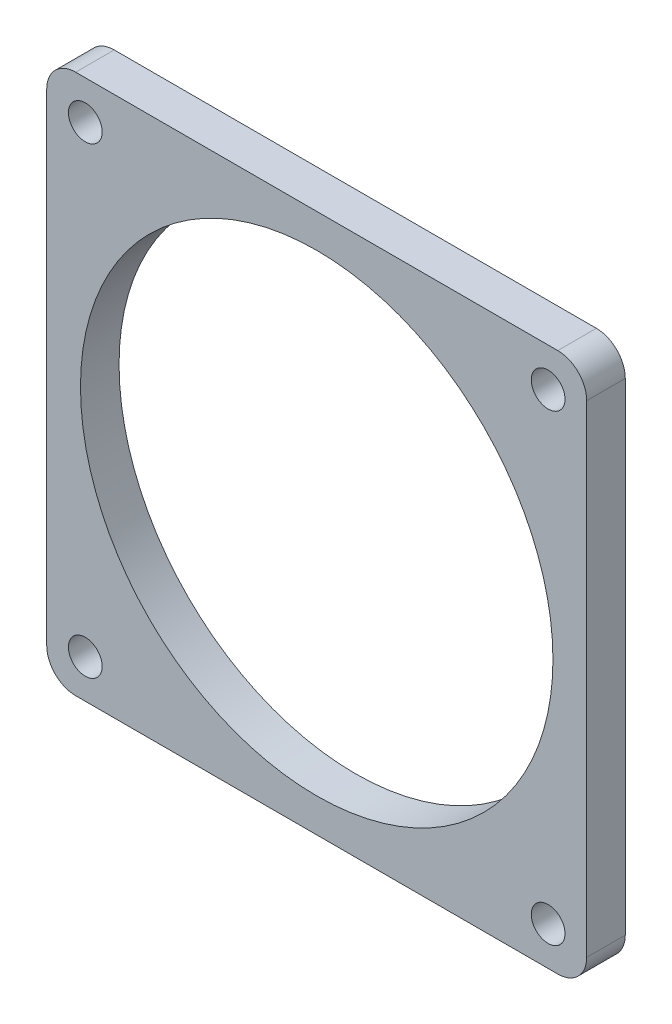
ISO-10303-21;
HEADER;
FILE_DESCRIPTION(('STEP AP214'),'2;1');
FILE_NAME('part.step','',(''),(''),'','','');
FILE_SCHEMA(('AUTOMOTIVE_DESIGN { 1 0 10303 214 1 1 1 1 }'));
ENDSEC;
DATA;
#1=APPLICATION_CONTEXT('core data for automotive mechanical design processes');
#2=APPLICATION_PROTOCOL_DEFINITION('international standard','automotive_design',2000,#1);
#3=PRODUCT_CONTEXT('',#1,'mechanical');
#4=PRODUCT('Part','Part','',(#3));
#5=PRODUCT_RELATED_PRODUCT_CATEGORY('part','',(#4));
#6=PRODUCT_DEFINITION_FORMATION('','',#4);
#7=PRODUCT_DEFINITION_CONTEXT('part definition',#1,'design');
#8=PRODUCT_DEFINITION('design','',#6,#7);
#9=PRODUCT_DEFINITION_SHAPE('','',#8);
#10=(LENGTH_UNIT() NAMED_UNIT(*) SI_UNIT(.MILLI.,.METRE.));
#11=(NAMED_UNIT(*) PLANE_ANGLE_UNIT() SI_UNIT($,.RADIAN.));
#12=(NAMED_UNIT(*) SI_UNIT($,.STERADIAN.) SOLID_ANGLE_UNIT());
#13=UNCERTAINTY_MEASURE_WITH_UNIT(LENGTH_MEASURE(1.E-05),#10,'distance_accuracy_value','');
#14=(GEOMETRIC_REPRESENTATION_CONTEXT(3) GLOBAL_UNCERTAINTY_ASSIGNED_CONTEXT((#13)) GLOBAL_UNIT_ASSIGNED_CONTEXT((#10,
#11,#12)) REPRESENTATION_CONTEXT('',''));
#15=CARTESIAN_POINT('',(0.,0.,0.));
#16=DIRECTION('',(0.,0.,1.));
#17=DIRECTION('',(1.,0.,0.));
#18=AXIS2_PLACEMENT_3D('',#15,#16,#17);
#19=CARTESIAN_POINT('',(28.,28.,-4.));
#20=DIRECTION('',(1.,0.,0.));
#21=DIRECTION('',(0.,1.,0.));
#22=AXIS2_PLACEMENT_3D('',#19,#20,#21);
#23=PLANE('',#22);
#24=DIRECTION('',(0.,1.,0.));
#25=VECTOR('',#24,1.);
#26=CARTESIAN_POINT('',(28.,28.,-4.));
#27=LINE('',#26,#25);
#28=CARTESIAN_POINT('',(28.,-25.,-4.));
#29=VERTEX_POINT('',#28);
#30=CARTESIAN_POINT('',(28.,25.,-4.));
#31=VERTEX_POINT('',#30);
#32=EDGE_CURVE('E162',#29,#31,#27,.T.);
#33=ORIENTED_EDGE('',*,*,#32,.T.);
#34=DIRECTION('',(0.,0.,1.));
#35=VECTOR('',#34,1.);
#36=CARTESIAN_POINT('',(28.,25.,-4.));
#37=LINE('',#36,#35);
#38=CARTESIAN_POINT('',(28.,25.,0.));
#39=VERTEX_POINT('',#38);
#40=EDGE_CURVE('E11',#31,#39,#37,.T.);
#41=ORIENTED_EDGE('',*,*,#40,.T.);
#42=DIRECTION('',(0.,1.,0.));
#43=VECTOR('',#42,1.);
#44=CARTESIAN_POINT('',(28.,28.,0.));
#45=LINE('',#44,#43);
#46=CARTESIAN_POINT('',(28.,-25.,0.));
#47=VERTEX_POINT('',#46);
#48=EDGE_CURVE('E112',#47,#39,#45,.T.);
#49=ORIENTED_EDGE('',*,*,#48,.F.);
#50=DIRECTION('',(0.,0.,1.));
#51=VECTOR('',#50,1.);
#52=CARTESIAN_POINT('',(28.,-25.,-4.));
#53=LINE('',#52,#51);
#54=EDGE_CURVE('E48',#47,#29,#53,.F.);
#55=ORIENTED_EDGE('',*,*,#54,.T.);
#56=EDGE_LOOP('',(#33,#41,#49,#55));
#57=FACE_BOUND('',#56,.T.);
#58=ADVANCED_FACE('F40',(#57),#23,.T.);
#59=CARTESIAN_POINT('',(-28.,-28.,-4.));
#60=DIRECTION('',(0.,-1.,0.));
#61=DIRECTION('',(0.,0.,-1.));
#62=AXIS2_PLACEMENT_3D('',#59,#60,#61);
#63=PLANE('',#62);
#64=DIRECTION('',(1.,0.,0.));
#65=VECTOR('',#64,1.);
#66=CARTESIAN_POINT('',(-28.,-28.,0.));
#67=LINE('',#66,#65);
#68=CARTESIAN_POINT('',(-25.,-28.,0.));
#69=VERTEX_POINT('',#68);
#70=CARTESIAN_POINT('',(25.,-28.,0.));
#71=VERTEX_POINT('',#70);
#72=EDGE_CURVE('E138',#69,#71,#67,.T.);
#73=ORIENTED_EDGE('',*,*,#72,.F.);
#74=DIRECTION('',(0.,0.,1.));
#75=VECTOR('',#74,1.);
#76=CARTESIAN_POINT('',(-25.,-28.,-4.));
#77=LINE('',#76,#75);
#78=CARTESIAN_POINT('',(-25.,-28.,-4.));
#79=VERTEX_POINT('',#78);
#80=EDGE_CURVE('E62',#69,#79,#77,.F.);
#81=ORIENTED_EDGE('',*,*,#80,.T.);
#82=DIRECTION('',(1.,0.,0.));
#83=VECTOR('',#82,1.);
#84=CARTESIAN_POINT('',(-28.,-28.,-4.));
#85=LINE('',#84,#83);
#86=CARTESIAN_POINT('',(25.,-28.,-4.));
#87=VERTEX_POINT('',#86);
#88=EDGE_CURVE('E132',#79,#87,#85,.T.);
#89=ORIENTED_EDGE('',*,*,#88,.T.);
#90=DIRECTION('',(0.,0.,1.));
#91=VECTOR('',#90,1.);
#92=CARTESIAN_POINT('',(25.,-28.,-4.));
#93=LINE('',#92,#91);
#94=EDGE_CURVE('E156',#87,#71,#93,.T.);
#95=ORIENTED_EDGE('',*,*,#94,.T.);
#96=EDGE_LOOP('',(#73,#81,#89,#95));
#97=FACE_BOUND('',#96,.T.);
#98=ADVANCED_FACE('F170',(#97),#63,.T.);
#99=CARTESIAN_POINT('',(-28.,28.,-4.));
#100=DIRECTION('',(-1.,0.,0.));
#101=DIRECTION('',(0.,-1.,0.));
#102=AXIS2_PLACEMENT_3D('',#99,#100,#101);
#103=PLANE('',#102);
#104=DIRECTION('',(0.,-1.,0.));
#105=VECTOR('',#104,1.);
#106=CARTESIAN_POINT('',(-28.,28.,0.));
#107=LINE('',#106,#105);
#108=CARTESIAN_POINT('',(-28.,25.,0.));
#109=VERTEX_POINT('',#108);
#110=CARTESIAN_POINT('',(-28.,-25.,0.));
#111=VERTEX_POINT('',#110);
#112=EDGE_CURVE('E127',#109,#111,#107,.T.);
#113=ORIENTED_EDGE('',*,*,#112,.F.);
#114=DIRECTION('',(0.,0.,1.));
#115=VECTOR('',#114,1.);
#116=CARTESIAN_POINT('',(-28.,25.,-4.));
#117=LINE('',#116,#115);
#118=CARTESIAN_POINT('',(-28.,25.,-4.));
#119=VERTEX_POINT('',#118);
#120=EDGE_CURVE('E148',#109,#119,#117,.F.);
#121=ORIENTED_EDGE('',*,*,#120,.T.);
#122=DIRECTION('',(0.,-1.,0.));
#123=VECTOR('',#122,1.);
#124=CARTESIAN_POINT('',(-28.,28.,-4.));
#125=LINE('',#124,#123);
#126=CARTESIAN_POINT('',(-28.,-25.,-4.));
#127=VERTEX_POINT('',#126);
#128=EDGE_CURVE('E135',#119,#127,#125,.T.);
#129=ORIENTED_EDGE('',*,*,#128,.T.);
#130=DIRECTION('',(0.,0.,1.));
#131=VECTOR('',#130,1.);
#132=CARTESIAN_POINT('',(-28.,-25.,-4.));
#133=LINE('',#132,#131);
#134=EDGE_CURVE('E145',#127,#111,#133,.T.);
#135=ORIENTED_EDGE('',*,*,#134,.T.);
#136=EDGE_LOOP('',(#113,#121,#129,#135));
#137=FACE_BOUND('',#136,.T.);
#138=ADVANCED_FACE('F238',(#137),#103,.T.);
#139=CARTESIAN_POINT('',(-28.,28.,-4.));
#140=DIRECTION('',(0.,1.,0.));
#141=DIRECTION('',(0.,0.,1.));
#142=AXIS2_PLACEMENT_3D('',#139,#140,#141);
#143=PLANE('',#142);
#144=DIRECTION('',(-1.,0.,0.));
#145=VECTOR('',#144,1.);
#146=CARTESIAN_POINT('',(-28.,28.,-4.));
#147=LINE('',#146,#145);
#148=CARTESIAN_POINT('',(25.,28.,-4.));
#149=VERTEX_POINT('',#148);
#150=CARTESIAN_POINT('',(-25.,28.,-4.));
#151=VERTEX_POINT('',#150);
#152=EDGE_CURVE('E166',#149,#151,#147,.T.);
#153=ORIENTED_EDGE('',*,*,#152,.T.);
#154=DIRECTION('',(0.,0.,1.));
#155=VECTOR('',#154,1.);
#156=CARTESIAN_POINT('',(-25.,28.,-4.));
#157=LINE('',#156,#155);
#158=CARTESIAN_POINT('',(-25.,28.,0.));
#159=VERTEX_POINT('',#158);
#160=EDGE_CURVE('E126',#151,#159,#157,.T.);
#161=ORIENTED_EDGE('',*,*,#160,.T.);
#162=DIRECTION('',(-1.,0.,0.));
#163=VECTOR('',#162,1.);
#164=CARTESIAN_POINT('',(-28.,28.,0.));
#165=LINE('',#164,#163);
#166=CARTESIAN_POINT('',(25.,28.,0.));
#167=VERTEX_POINT('',#166);
#168=EDGE_CURVE('E110',#167,#159,#165,.T.);
#169=ORIENTED_EDGE('',*,*,#168,.F.);
#170=DIRECTION('',(0.,0.,1.));
#171=VECTOR('',#170,1.);
#172=CARTESIAN_POINT('',(25.,28.,-4.));
#173=LINE('',#172,#171);
#174=EDGE_CURVE('E123',#167,#149,#173,.F.);
#175=ORIENTED_EDGE('',*,*,#174,.T.);
#176=EDGE_LOOP('',(#153,#161,#169,#175));
#177=FACE_BOUND('',#176,.T.);
#178=ADVANCED_FACE('F122',(#177),#143,.T.);
#179=CARTESIAN_POINT('',(0.,0.,-4.));
#180=DIRECTION('',(0.,0.,1.));
#181=DIRECTION('',(1.,0.,0.));
#182=AXIS2_PLACEMENT_3D('',#179,#180,#181);
#183=PLANE('',#182);
#184=CARTESIAN_POINT('',(-23.9999999999995,-24.,-4.));
#185=DIRECTION('',(0.,0.,1.));
#186=DIRECTION('',(1.,0.,0.));
#187=AXIS2_PLACEMENT_3D('',#184,#185,#186);
#188=CIRCLE('',#187,1.75);
#189=CARTESIAN_POINT('',(-22.2499999999995,-24.,-4.));
#190=VERTEX_POINT('',#189);
#191=EDGE_CURVE('E188',#190,#190,#188,.T.);
#192=ORIENTED_EDGE('',*,*,#191,.T.);
#193=EDGE_LOOP('',(#192));
#194=FACE_BOUND('',#193,.T.);
#195=CARTESIAN_POINT('',(24.0000000000005,-24.,-4.));
#196=DIRECTION('',(0.,0.,1.));
#197=DIRECTION('',(1.,0.,0.));
#198=AXIS2_PLACEMENT_3D('',#195,#196,#197);
#199=CIRCLE('',#198,1.75);
#200=CARTESIAN_POINT('',(25.7500000000005,-24.,-4.));
#201=VERTEX_POINT('',#200);
#202=EDGE_CURVE('E194',#201,#201,#199,.T.);
#203=ORIENTED_EDGE('',*,*,#202,.T.);
#204=EDGE_LOOP('',(#203));
#205=FACE_BOUND('',#204,.T.);
#206=CARTESIAN_POINT('',(24.,24.,-4.));
#207=DIRECTION('',(0.,0.,1.));
#208=DIRECTION('',(1.,0.,0.));
#209=AXIS2_PLACEMENT_3D('',#206,#207,#208);
#210=CIRCLE('',#209,1.75);
#211=CARTESIAN_POINT('',(25.75,24.,-4.));
#212=VERTEX_POINT('',#211);
#213=EDGE_CURVE('E200',#212,#212,#210,.T.);
#214=ORIENTED_EDGE('',*,*,#213,.T.);
#215=EDGE_LOOP('',(#214));
#216=FACE_BOUND('',#215,.T.);
#217=CARTESIAN_POINT('',(-24.,24.,-4.));
#218=DIRECTION('',(0.,0.,1.));
#219=DIRECTION('',(1.,0.,0.));
#220=AXIS2_PLACEMENT_3D('',#217,#218,#219);
#221=CIRCLE('',#220,1.75);
#222=CARTESIAN_POINT('',(-22.25,24.,-4.));
#223=VERTEX_POINT('',#222);
#224=EDGE_CURVE('E182',#223,#223,#221,.T.);
#225=ORIENTED_EDGE('',*,*,#224,.T.);
#226=EDGE_LOOP('',(#225));
#227=FACE_BOUND('',#226,.T.);
#228=CARTESIAN_POINT('',(0.,0.,-4.));
#229=DIRECTION('',(0.,0.,1.));
#230=DIRECTION('',(1.,0.,0.));
#231=AXIS2_PLACEMENT_3D('',#228,#229,#230);
#232=CIRCLE('',#231,24.5);
#233=CARTESIAN_POINT('',(24.5,0.,-4.));
#234=VERTEX_POINT('',#233);
#235=EDGE_CURVE('E174',#234,#234,#232,.T.);
#236=ORIENTED_EDGE('',*,*,#235,.T.);
#237=EDGE_LOOP('',(#236));
#238=FACE_BOUND('',#237,.T.);
#239=ORIENTED_EDGE('',*,*,#128,.F.);
#240=CARTESIAN_POINT('',(-25.,25.,-4.));
#241=DIRECTION('',(0.,0.,1.));
#242=DIRECTION('',(1.,0.,0.));
#243=AXIS2_PLACEMENT_3D('',#240,#241,#242);
#244=CIRCLE('',#243,3.);
#245=EDGE_CURVE('E154',#119,#151,#244,.F.);
#246=ORIENTED_EDGE('',*,*,#245,.T.);
#247=ORIENTED_EDGE('',*,*,#152,.F.);
#248=CARTESIAN_POINT('',(25.,25.,-4.));
#249=DIRECTION('',(0.,0.,1.));
#250=DIRECTION('',(1.,0.,0.));
#251=AXIS2_PLACEMENT_3D('',#248,#249,#250);
#252=CIRCLE('',#251,3.);
#253=EDGE_CURVE('E131',#149,#31,#252,.F.);
#254=ORIENTED_EDGE('',*,*,#253,.T.);
#255=ORIENTED_EDGE('',*,*,#32,.F.);
#256=CARTESIAN_POINT('',(25.,-25.,-4.));
#257=DIRECTION('',(0.,0.,1.));
#258=DIRECTION('',(1.,0.,0.));
#259=AXIS2_PLACEMENT_3D('',#256,#257,#258);
#260=CIRCLE('',#259,3.);
#261=EDGE_CURVE('E55',#29,#87,#260,.F.);
#262=ORIENTED_EDGE('',*,*,#261,.T.);
#263=ORIENTED_EDGE('',*,*,#88,.F.);
#264=CARTESIAN_POINT('',(-25.,-25.,-4.));
#265=DIRECTION('',(0.,0.,1.));
#266=DIRECTION('',(1.,0.,0.));
#267=AXIS2_PLACEMENT_3D('',#264,#265,#266);
#268=CIRCLE('',#267,3.);
#269=EDGE_CURVE('E152',#79,#127,#268,.F.);
#270=ORIENTED_EDGE('',*,*,#269,.T.);
#271=EDGE_LOOP('',(#239,#246,#247,#254,#255,#262,#263,#270));
#272=FACE_BOUND('',#271,.T.);
#273=ADVANCED_FACE('F165',(#194,#205,#216,#227,#238,#272),#183,.F.);
#274=CARTESIAN_POINT('',(0.,0.,0.));
#275=DIRECTION('',(0.,0.,1.));
#276=DIRECTION('',(1.,0.,0.));
#277=AXIS2_PLACEMENT_3D('',#274,#275,#276);
#278=PLANE('',#277);
#279=CARTESIAN_POINT('',(-23.9999999999995,-24.,0.));
#280=DIRECTION('',(0.,0.,1.));
#281=DIRECTION('',(1.,0.,0.));
#282=AXIS2_PLACEMENT_3D('',#279,#280,#281);
#283=CIRCLE('',#282,1.75);
#284=CARTESIAN_POINT('',(-22.2499999999995,-24.,0.));
#285=VERTEX_POINT('',#284);
#286=EDGE_CURVE('E185',#285,#285,#283,.T.);
#287=ORIENTED_EDGE('',*,*,#286,.F.);
#288=EDGE_LOOP('',(#287));
#289=FACE_BOUND('',#288,.T.);
#290=CARTESIAN_POINT('',(24.0000000000005,-24.,0.));
#291=DIRECTION('',(0.,0.,1.));
#292=DIRECTION('',(1.,0.,0.));
#293=AXIS2_PLACEMENT_3D('',#290,#291,#292);
#294=CIRCLE('',#293,1.75);
#295=CARTESIAN_POINT('',(25.7500000000005,-24.,0.));
#296=VERTEX_POINT('',#295);
#297=EDGE_CURVE('E191',#296,#296,#294,.T.);
#298=ORIENTED_EDGE('',*,*,#297,.F.);
#299=EDGE_LOOP('',(#298));
#300=FACE_BOUND('',#299,.T.);
#301=CARTESIAN_POINT('',(24.,24.,0.));
#302=DIRECTION('',(0.,0.,1.));
#303=DIRECTION('',(1.,0.,0.));
#304=AXIS2_PLACEMENT_3D('',#301,#302,#303);
#305=CIRCLE('',#304,1.75);
#306=CARTESIAN_POINT('',(25.75,24.,0.));
#307=VERTEX_POINT('',#306);
#308=EDGE_CURVE('E197',#307,#307,#305,.T.);
#309=ORIENTED_EDGE('',*,*,#308,.F.);
#310=EDGE_LOOP('',(#309));
#311=FACE_BOUND('',#310,.T.);
#312=CARTESIAN_POINT('',(-24.,24.,0.));
#313=DIRECTION('',(0.,0.,1.));
#314=DIRECTION('',(1.,0.,0.));
#315=AXIS2_PLACEMENT_3D('',#312,#313,#314);
#316=CIRCLE('',#315,1.75);
#317=CARTESIAN_POINT('',(-22.25,24.,0.));
#318=VERTEX_POINT('',#317);
#319=EDGE_CURVE('E203',#318,#318,#316,.T.);
#320=ORIENTED_EDGE('',*,*,#319,.F.);
#321=EDGE_LOOP('',(#320));
#322=FACE_BOUND('',#321,.T.);
#323=CARTESIAN_POINT('',(0.,0.,0.));
#324=DIRECTION('',(0.,0.,1.));
#325=DIRECTION('',(1.,0.,0.));
#326=AXIS2_PLACEMENT_3D('',#323,#324,#325);
#327=CIRCLE('',#326,24.5);
#328=CARTESIAN_POINT('',(24.5,0.,0.));
#329=VERTEX_POINT('',#328);
#330=EDGE_CURVE('E179',#329,#329,#327,.T.);
#331=ORIENTED_EDGE('',*,*,#330,.F.);
#332=EDGE_LOOP('',(#331));
#333=FACE_BOUND('',#332,.T.);
#334=ORIENTED_EDGE('',*,*,#168,.T.);
#335=CARTESIAN_POINT('',(-25.,25.,0.));
#336=DIRECTION('',(0.,0.,1.));
#337=DIRECTION('',(1.,0.,0.));
#338=AXIS2_PLACEMENT_3D('',#335,#336,#337);
#339=CIRCLE('',#338,3.);
#340=EDGE_CURVE('E143',#159,#109,#339,.T.);
#341=ORIENTED_EDGE('',*,*,#340,.T.);
#342=ORIENTED_EDGE('',*,*,#112,.T.);
#343=CARTESIAN_POINT('',(-25.,-25.,0.));
#344=DIRECTION('',(0.,0.,1.));
#345=DIRECTION('',(1.,0.,0.));
#346=AXIS2_PLACEMENT_3D('',#343,#344,#345);
#347=CIRCLE('',#346,3.);
#348=EDGE_CURVE('E116',#111,#69,#347,.T.);
#349=ORIENTED_EDGE('',*,*,#348,.T.);
#350=ORIENTED_EDGE('',*,*,#72,.T.);
#351=CARTESIAN_POINT('',(25.,-25.,0.));
#352=DIRECTION('',(0.,0.,1.));
#353=DIRECTION('',(1.,0.,0.));
#354=AXIS2_PLACEMENT_3D('',#351,#352,#353);
#355=CIRCLE('',#354,3.);
#356=EDGE_CURVE('E117',#71,#47,#355,.T.);
#357=ORIENTED_EDGE('',*,*,#356,.T.);
#358=ORIENTED_EDGE('',*,*,#48,.T.);
#359=CARTESIAN_POINT('',(25.,25.,0.));
#360=DIRECTION('',(0.,0.,1.));
#361=DIRECTION('',(1.,0.,0.));
#362=AXIS2_PLACEMENT_3D('',#359,#360,#361);
#363=CIRCLE('',#362,3.);
#364=EDGE_CURVE('E107',#39,#167,#363,.T.);
#365=ORIENTED_EDGE('',*,*,#364,.T.);
#366=EDGE_LOOP('',(#334,#341,#342,#349,#350,#357,#358,#365));
#367=FACE_BOUND('',#366,.T.);
#368=ADVANCED_FACE('F109',(#289,#300,#311,#322,#333,#367),#278,.T.);
#369=CARTESIAN_POINT('',(0.,0.,-4.));
#370=DIRECTION('',(0.,0.,1.));
#371=DIRECTION('',(1.,0.,0.));
#372=AXIS2_PLACEMENT_3D('',#369,#370,#371);
#373=CYLINDRICAL_SURFACE('',#372,24.5);
#374=ORIENTED_EDGE('',*,*,#235,.F.);
#375=EDGE_LOOP('',(#374));
#376=FACE_BOUND('',#375,.T.);
#377=ORIENTED_EDGE('',*,*,#330,.T.);
#378=EDGE_LOOP('',(#377));
#379=FACE_BOUND('',#378,.T.);
#380=ADVANCED_FACE('F215',(#376,#379),#373,.F.);
#381=CARTESIAN_POINT('',(-24.,24.,-4.));
#382=DIRECTION('',(0.,0.,1.));
#383=DIRECTION('',(1.,0.,0.));
#384=AXIS2_PLACEMENT_3D('',#381,#382,#383);
#385=CYLINDRICAL_SURFACE('',#384,1.75);
#386=ORIENTED_EDGE('',*,*,#224,.F.);
#387=EDGE_LOOP('',(#386));
#388=FACE_BOUND('',#387,.T.);
#389=ORIENTED_EDGE('',*,*,#319,.T.);
#390=EDGE_LOOP('',(#389));
#391=FACE_BOUND('',#390,.T.);
#392=ADVANCED_FACE('F211',(#388,#391),#385,.F.);
#393=CARTESIAN_POINT('',(24.,24.,-4.));
#394=DIRECTION('',(0.,0.,1.));
#395=DIRECTION('',(1.,0.,0.));
#396=AXIS2_PLACEMENT_3D('',#393,#394,#395);
#397=CYLINDRICAL_SURFACE('',#396,1.75);
#398=ORIENTED_EDGE('',*,*,#213,.F.);
#399=EDGE_LOOP('',(#398));
#400=FACE_BOUND('',#399,.T.);
#401=ORIENTED_EDGE('',*,*,#308,.T.);
#402=EDGE_LOOP('',(#401));
#403=FACE_BOUND('',#402,.T.);
#404=ADVANCED_FACE('F214',(#400,#403),#397,.F.);
#405=CARTESIAN_POINT('',(24.0000000000005,-24.,-4.));
#406=DIRECTION('',(0.,0.,1.));
#407=DIRECTION('',(1.,0.,0.));
#408=AXIS2_PLACEMENT_3D('',#405,#406,#407);
#409=CYLINDRICAL_SURFACE('',#408,1.75);
#410=ORIENTED_EDGE('',*,*,#202,.F.);
#411=EDGE_LOOP('',(#410));
#412=FACE_BOUND('',#411,.T.);
#413=ORIENTED_EDGE('',*,*,#297,.T.);
#414=EDGE_LOOP('',(#413));
#415=FACE_BOUND('',#414,.T.);
#416=ADVANCED_FACE('F332',(#412,#415),#409,.F.);
#417=CARTESIAN_POINT('',(-23.9999999999995,-24.,-4.));
#418=DIRECTION('',(0.,0.,1.));
#419=DIRECTION('',(1.,0.,0.));
#420=AXIS2_PLACEMENT_3D('',#417,#418,#419);
#421=CYLINDRICAL_SURFACE('',#420,1.75);
#422=ORIENTED_EDGE('',*,*,#191,.F.);
#423=EDGE_LOOP('',(#422));
#424=FACE_BOUND('',#423,.T.);
#425=ORIENTED_EDGE('',*,*,#286,.T.);
#426=EDGE_LOOP('',(#425));
#427=FACE_BOUND('',#426,.T.);
#428=ADVANCED_FACE('F247',(#424,#427),#421,.F.);
#429=CARTESIAN_POINT('',(-25.,25.,-4.));
#430=DIRECTION('',(0.,0.,1.));
#431=DIRECTION('',(1.,0.,0.));
#432=AXIS2_PLACEMENT_3D('',#429,#430,#431);
#433=CYLINDRICAL_SURFACE('',#432,3.);
#434=ORIENTED_EDGE('',*,*,#245,.F.);
#435=ORIENTED_EDGE('',*,*,#120,.F.);
#436=ORIENTED_EDGE('',*,*,#340,.F.);
#437=ORIENTED_EDGE('',*,*,#160,.F.);
#438=EDGE_LOOP('',(#434,#435,#436,#437));
#439=FACE_BOUND('',#438,.T.);
#440=ADVANCED_FACE('F243',(#439),#433,.T.);
#441=CARTESIAN_POINT('',(-25.,-25.,-4.));
#442=DIRECTION('',(0.,0.,1.));
#443=DIRECTION('',(1.,0.,0.));
#444=AXIS2_PLACEMENT_3D('',#441,#442,#443);
#445=CYLINDRICAL_SURFACE('',#444,3.);
#446=ORIENTED_EDGE('',*,*,#269,.F.);
#447=ORIENTED_EDGE('',*,*,#80,.F.);
#448=ORIENTED_EDGE('',*,*,#348,.F.);
#449=ORIENTED_EDGE('',*,*,#134,.F.);
#450=EDGE_LOOP('',(#446,#447,#448,#449));
#451=FACE_BOUND('',#450,.T.);
#452=ADVANCED_FACE('F246',(#451),#445,.T.);
#453=CARTESIAN_POINT('',(25.,25.,-4.));
#454=DIRECTION('',(0.,0.,1.));
#455=DIRECTION('',(1.,0.,0.));
#456=AXIS2_PLACEMENT_3D('',#453,#454,#455);
#457=CYLINDRICAL_SURFACE('',#456,3.);
#458=ORIENTED_EDGE('',*,*,#253,.F.);
#459=ORIENTED_EDGE('',*,*,#174,.F.);
#460=ORIENTED_EDGE('',*,*,#364,.F.);
#461=ORIENTED_EDGE('',*,*,#40,.F.);
#462=EDGE_LOOP('',(#458,#459,#460,#461));
#463=FACE_BOUND('',#462,.T.);
#464=ADVANCED_FACE('F130',(#463),#457,.T.);
#465=CARTESIAN_POINT('',(25.,-25.,-4.));
#466=DIRECTION('',(0.,0.,1.));
#467=DIRECTION('',(1.,0.,0.));
#468=AXIS2_PLACEMENT_3D('',#465,#466,#467);
#469=CYLINDRICAL_SURFACE('',#468,3.);
#470=ORIENTED_EDGE('',*,*,#261,.F.);
#471=ORIENTED_EDGE('',*,*,#54,.F.);
#472=ORIENTED_EDGE('',*,*,#356,.F.);
#473=ORIENTED_EDGE('',*,*,#94,.F.);
#474=EDGE_LOOP('',(#470,#471,#472,#473));
#475=FACE_BOUND('',#474,.T.);
#476=ADVANCED_FACE('F42',(#475),#469,.T.);
#477=CLOSED_SHELL('',(#58,#98,#138,#178,#273,#368,#380,#392,#404,#416,#428,#440,#452,#464,#476));
#478=MANIFOLD_SOLID_BREP('B2',#477);
#479=ADVANCED_BREP_SHAPE_REPRESENTATION('',(#18,#478),#14);
#480=SHAPE_DEFINITION_REPRESENTATION(#9,#479);
ENDSEC;
END-ISO-10303-21;
